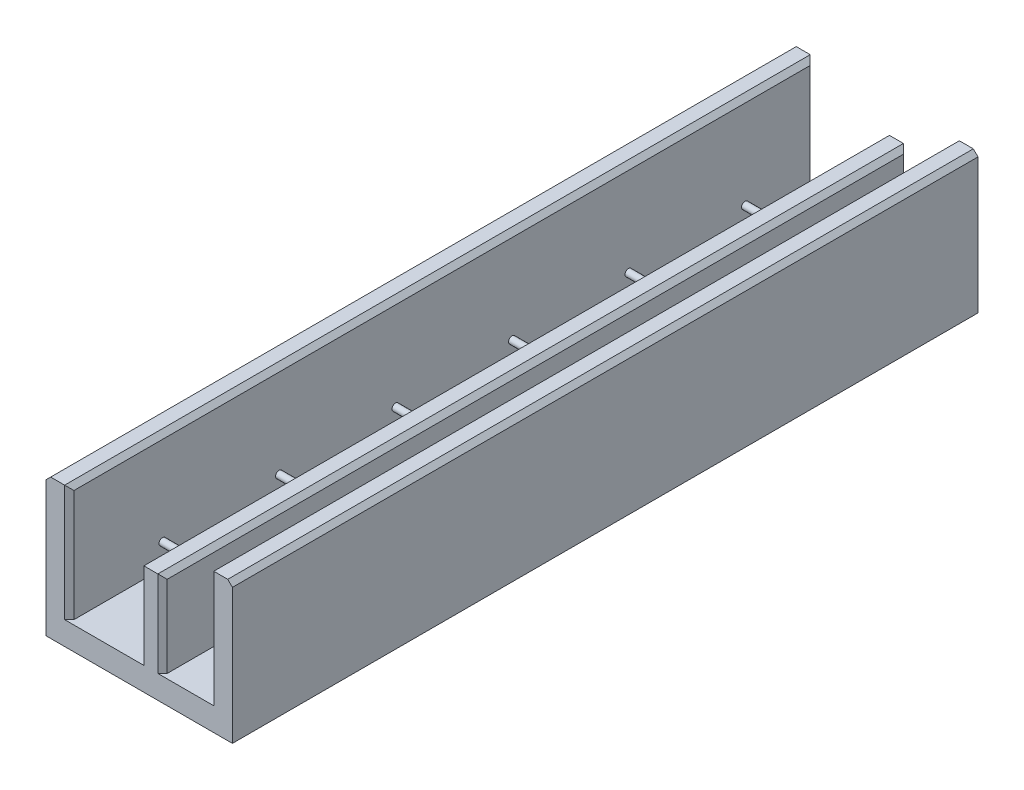
ISO-10303-21;
HEADER;
FILE_DESCRIPTION(('STEP AP214'),'2;1');
FILE_NAME('part.step','',(''),(''),'','','');
FILE_SCHEMA(('AUTOMOTIVE_DESIGN { 1 0 10303 214 1 1 1 1 }'));
ENDSEC;
DATA;
#1=APPLICATION_CONTEXT('core data for automotive mechanical design processes');
#2=APPLICATION_PROTOCOL_DEFINITION('international standard','automotive_design',2000,#1);
#3=PRODUCT_CONTEXT('',#1,'mechanical');
#4=PRODUCT('Part','Part','',(#3));
#5=PRODUCT_RELATED_PRODUCT_CATEGORY('part','',(#4));
#6=PRODUCT_DEFINITION_FORMATION('','',#4);
#7=PRODUCT_DEFINITION_CONTEXT('part definition',#1,'design');
#8=PRODUCT_DEFINITION('design','',#6,#7);
#9=PRODUCT_DEFINITION_SHAPE('','',#8);
#10=(LENGTH_UNIT() NAMED_UNIT(*) SI_UNIT(.MILLI.,.METRE.));
#11=(NAMED_UNIT(*) PLANE_ANGLE_UNIT() SI_UNIT($,.RADIAN.));
#12=(NAMED_UNIT(*) SI_UNIT($,.STERADIAN.) SOLID_ANGLE_UNIT());
#13=UNCERTAINTY_MEASURE_WITH_UNIT(LENGTH_MEASURE(1.E-05),#10,'distance_accuracy_value','');
#14=(GEOMETRIC_REPRESENTATION_CONTEXT(3) GLOBAL_UNCERTAINTY_ASSIGNED_CONTEXT((#13)) GLOBAL_UNIT_ASSIGNED_CONTEXT((#10,
#11,#12)) REPRESENTATION_CONTEXT('',''));
#15=CARTESIAN_POINT('',(0.,0.,0.));
#16=DIRECTION('',(0.,0.,1.));
#17=DIRECTION('',(1.,0.,0.));
#18=AXIS2_PLACEMENT_3D('',#15,#16,#17);
#19=CARTESIAN_POINT('',(0.,600.,3200.));
#20=DIRECTION('',(-1.,0.,0.));
#21=DIRECTION('',(0.,0.,1.));
#22=AXIS2_PLACEMENT_3D('',#19,#20,#21);
#23=PLANE('',#22);
#24=DIRECTION('',(0.,1.,0.));
#25=VECTOR('',#24,1.);
#26=CARTESIAN_POINT('',(0.,600.,0.));
#27=LINE('',#26,#25);
#28=CARTESIAN_POINT('',(0.,0.,0.));
#29=VERTEX_POINT('',#28);
#30=CARTESIAN_POINT('',(0.,580.,0.));
#31=VERTEX_POINT('',#30);
#32=EDGE_CURVE('E219',#29,#31,#27,.T.);
#33=ORIENTED_EDGE('',*,*,#32,.T.);
#34=DIRECTION('',(0.,0.,1.));
#35=VECTOR('',#34,1.);
#36=CARTESIAN_POINT('',(0.,580.,3200.));
#37=LINE('',#36,#35);
#38=CARTESIAN_POINT('',(0.,580.,3200.));
#39=VERTEX_POINT('',#38);
#40=EDGE_CURVE('E289',#31,#39,#37,.T.);
#41=ORIENTED_EDGE('',*,*,#40,.T.);
#42=DIRECTION('',(0.,1.,0.));
#43=VECTOR('',#42,1.);
#44=CARTESIAN_POINT('',(0.,600.,3200.));
#45=LINE('',#44,#43);
#46=CARTESIAN_POINT('',(0.,0.,3200.));
#47=VERTEX_POINT('',#46);
#48=EDGE_CURVE('E238',#47,#39,#45,.T.);
#49=ORIENTED_EDGE('',*,*,#48,.F.);
#50=DIRECTION('',(0.,0.,-1.));
#51=VECTOR('',#50,1.);
#52=CARTESIAN_POINT('',(0.,0.,3200.));
#53=LINE('',#52,#51);
#54=EDGE_CURVE('E210',#47,#29,#53,.T.);
#55=ORIENTED_EDGE('',*,*,#54,.T.);
#56=EDGE_LOOP('',(#33,#41,#49,#55));
#57=FACE_BOUND('',#56,.T.);
#58=ADVANCED_FACE('F37',(#57),#23,.F.);
#59=CARTESIAN_POINT('',(-99.9999999999998,600.,3200.));
#60=DIRECTION('',(0.,-1.,0.));
#61=DIRECTION('',(0.,0.,-1.));
#62=AXIS2_PLACEMENT_3D('',#59,#60,#61);
#63=PLANE('',#62);
#64=DIRECTION('',(-1.,0.,0.));
#65=VECTOR('',#64,1.);
#66=CARTESIAN_POINT('',(-99.9999999999998,600.,3200.));
#67=LINE('',#66,#65);
#68=CARTESIAN_POINT('',(-20.,600.,3200.));
#69=VERTEX_POINT('',#68);
#70=CARTESIAN_POINT('',(-79.9999999999997,600.,3200.));
#71=VERTEX_POINT('',#70);
#72=EDGE_CURVE('E369',#69,#71,#67,.T.);
#73=ORIENTED_EDGE('',*,*,#72,.F.);
#74=DIRECTION('',(0.,0.,-1.));
#75=VECTOR('',#74,1.);
#76=CARTESIAN_POINT('',(-20.,600.,3200.));
#77=LINE('',#76,#75);
#78=CARTESIAN_POINT('',(-20.,600.,0.));
#79=VERTEX_POINT('',#78);
#80=EDGE_CURVE('E286',#69,#79,#77,.T.);
#81=ORIENTED_EDGE('',*,*,#80,.T.);
#82=DIRECTION('',(-1.,0.,0.));
#83=VECTOR('',#82,1.);
#84=CARTESIAN_POINT('',(-99.9999999999998,600.,0.));
#85=LINE('',#84,#83);
#86=CARTESIAN_POINT('',(-79.9999999999997,600.,0.));
#87=VERTEX_POINT('',#86);
#88=EDGE_CURVE('E222',#79,#87,#85,.T.);
#89=ORIENTED_EDGE('',*,*,#88,.T.);
#90=DIRECTION('',(0.,0.,1.));
#91=VECTOR('',#90,1.);
#92=CARTESIAN_POINT('',(-79.9999999999997,600.,3200.));
#93=LINE('',#92,#91);
#94=EDGE_CURVE('E284',#87,#71,#93,.T.);
#95=ORIENTED_EDGE('',*,*,#94,.T.);
#96=EDGE_LOOP('',(#73,#81,#89,#95));
#97=FACE_BOUND('',#96,.T.);
#98=ADVANCED_FACE('F398',(#97),#63,.F.);
#99=CARTESIAN_POINT('',(-99.9999999999998,99.9999999999999,3200.));
#100=DIRECTION('',(1.,0.,0.));
#101=DIRECTION('',(0.,0.,-1.));
#102=AXIS2_PLACEMENT_3D('',#99,#100,#101);
#103=PLANE('',#102);
#104=CARTESIAN_POINT('',(-99.9999999999998,200.,2800.));
#105=DIRECTION('',(1.,0.,0.));
#106=DIRECTION('',(0.,0.,-1.));
#107=AXIS2_PLACEMENT_3D('',#104,#105,#106);
#108=CIRCLE('',#107,15.);
#109=CARTESIAN_POINT('',(-99.9999999999998,200.,2785.));
#110=VERTEX_POINT('',#109);
#111=EDGE_CURVE('E925',#110,#110,#108,.F.);
#112=ORIENTED_EDGE('',*,*,#111,.F.);
#113=EDGE_LOOP('',(#112));
#114=FACE_BOUND('',#113,.T.);
#115=CARTESIAN_POINT('',(-99.9999999999998,200.,2300.));
#116=DIRECTION('',(1.,0.,0.));
#117=DIRECTION('',(0.,0.,-1.));
#118=AXIS2_PLACEMENT_3D('',#115,#116,#117);
#119=CIRCLE('',#118,15.);
#120=CARTESIAN_POINT('',(-99.9999999999998,200.,2285.));
#121=VERTEX_POINT('',#120);
#122=EDGE_CURVE('E916',#121,#121,#119,.F.);
#123=ORIENTED_EDGE('',*,*,#122,.F.);
#124=EDGE_LOOP('',(#123));
#125=FACE_BOUND('',#124,.T.);
#126=CARTESIAN_POINT('',(-99.9999999999998,200.,1800.));
#127=DIRECTION('',(1.,0.,0.));
#128=DIRECTION('',(0.,0.,-1.));
#129=AXIS2_PLACEMENT_3D('',#126,#127,#128);
#130=CIRCLE('',#129,15.);
#131=CARTESIAN_POINT('',(-99.9999999999998,200.,1785.));
#132=VERTEX_POINT('',#131);
#133=EDGE_CURVE('E906',#132,#132,#130,.F.);
#134=ORIENTED_EDGE('',*,*,#133,.F.);
#135=EDGE_LOOP('',(#134));
#136=FACE_BOUND('',#135,.T.);
#137=CARTESIAN_POINT('',(-99.9999999999998,200.,1300.));
#138=DIRECTION('',(1.,0.,0.));
#139=DIRECTION('',(0.,0.,-1.));
#140=AXIS2_PLACEMENT_3D('',#137,#138,#139);
#141=CIRCLE('',#140,15.);
#142=CARTESIAN_POINT('',(-99.9999999999998,200.,1285.));
#143=VERTEX_POINT('',#142);
#144=EDGE_CURVE('E896',#143,#143,#141,.F.);
#145=ORIENTED_EDGE('',*,*,#144,.F.);
#146=EDGE_LOOP('',(#145));
#147=FACE_BOUND('',#146,.T.);
#148=CARTESIAN_POINT('',(-99.9999999999998,200.,800.));
#149=DIRECTION('',(1.,0.,0.));
#150=DIRECTION('',(0.,0.,-1.));
#151=AXIS2_PLACEMENT_3D('',#148,#149,#150);
#152=CIRCLE('',#151,15.);
#153=CARTESIAN_POINT('',(-99.9999999999998,200.,785.));
#154=VERTEX_POINT('',#153);
#155=EDGE_CURVE('E885',#154,#154,#152,.F.);
#156=ORIENTED_EDGE('',*,*,#155,.F.);
#157=EDGE_LOOP('',(#156));
#158=FACE_BOUND('',#157,.T.);
#159=CARTESIAN_POINT('',(-99.9999999999998,200.,300.));
#160=DIRECTION('',(1.,0.,0.));
#161=DIRECTION('',(0.,0.,-1.));
#162=AXIS2_PLACEMENT_3D('',#159,#160,#161);
#163=CIRCLE('',#162,15.);
#164=CARTESIAN_POINT('',(-99.9999999999998,200.,285.));
#165=VERTEX_POINT('',#164);
#166=EDGE_CURVE('E556',#165,#165,#163,.F.);
#167=ORIENTED_EDGE('',*,*,#166,.F.);
#168=EDGE_LOOP('',(#167));
#169=FACE_BOUND('',#168,.T.);
#170=DIRECTION('',(0.,0.,-1.));
#171=VECTOR('',#170,1.);
#172=CARTESIAN_POINT('',(-99.9999999999998,580.,3200.));
#173=LINE('',#172,#171);
#174=CARTESIAN_POINT('',(-99.9999999999998,580.,3180.));
#175=VERTEX_POINT('',#174);
#176=CARTESIAN_POINT('',(-99.9999999999998,580.,19.9999999999996));
#177=VERTEX_POINT('',#176);
#178=EDGE_CURVE('E300',#175,#177,#173,.T.);
#179=ORIENTED_EDGE('',*,*,#178,.T.);
#180=DIRECTION('',(0.,-1.,0.));
#181=VECTOR('',#180,1.);
#182=CARTESIAN_POINT('',(-99.9999999999998,99.9999999999999,19.9999999999996));
#183=LINE('',#182,#181);
#184=CARTESIAN_POINT('',(-99.9999999999998,99.9999999999999,19.9999999999996));
#185=VERTEX_POINT('',#184);
#186=EDGE_CURVE('E302',#177,#185,#183,.T.);
#187=ORIENTED_EDGE('',*,*,#186,.T.);
#188=DIRECTION('',(0.,0.,-1.));
#189=VECTOR('',#188,1.);
#190=CARTESIAN_POINT('',(-99.9999999999998,99.9999999999999,3200.));
#191=LINE('',#190,#189);
#192=CARTESIAN_POINT('',(-99.9999999999998,99.9999999999999,3180.));
#193=VERTEX_POINT('',#192);
#194=EDGE_CURVE('E248',#193,#185,#191,.T.);
#195=ORIENTED_EDGE('',*,*,#194,.F.);
#196=DIRECTION('',(0.,1.,0.));
#197=VECTOR('',#196,1.);
#198=CARTESIAN_POINT('',(-99.9999999999998,99.9999999999999,3180.));
#199=LINE('',#198,#197);
#200=EDGE_CURVE('E298',#193,#175,#199,.T.);
#201=ORIENTED_EDGE('',*,*,#200,.T.);
#202=EDGE_LOOP('',(#179,#187,#195,#201));
#203=FACE_BOUND('',#202,.T.);
#204=ADVANCED_FACE('F418',(#114,#125,#136,#147,#158,#169,#203),#103,.F.);
#205=CARTESIAN_POINT('',(-300.,99.9999999999999,3200.));
#206=DIRECTION('',(0.,-1.,0.));
#207=DIRECTION('',(1.,0.,0.));
#208=AXIS2_PLACEMENT_3D('',#205,#206,#207);
#209=PLANE('',#208);
#210=DIRECTION('',(-1.,0.,0.));
#211=VECTOR('',#210,1.);
#212=CARTESIAN_POINT('',(-300.,99.9999999999999,0.));
#213=LINE('',#212,#211);
#214=CARTESIAN_POINT('',(-79.9999999999997,99.9999999999999,0.));
#215=VERTEX_POINT('',#214);
#216=CARTESIAN_POINT('',(-320.,99.9999999999999,0.));
#217=VERTEX_POINT('',#216);
#218=EDGE_CURVE('E226',#215,#217,#213,.T.);
#219=ORIENTED_EDGE('',*,*,#218,.T.);
#220=DIRECTION('',(0.707106781186548,0.,0.707106781186547));
#221=VECTOR('',#220,1.);
#222=CARTESIAN_POINT('',(1290.,100.,1610.));
#223=LINE('',#222,#221);
#224=CARTESIAN_POINT('',(-300.,99.9999999999999,20.));
#225=VERTEX_POINT('',#224);
#226=EDGE_CURVE('E330',#217,#225,#223,.T.);
#227=ORIENTED_EDGE('',*,*,#226,.T.);
#228=DIRECTION('',(0.,0.,-1.));
#229=VECTOR('',#228,1.);
#230=CARTESIAN_POINT('',(-300.,99.9999999999999,3200.));
#231=LINE('',#230,#229);
#232=CARTESIAN_POINT('',(-300.,99.9999999999999,3180.));
#233=VERTEX_POINT('',#232);
#234=EDGE_CURVE('E245',#233,#225,#231,.T.);
#235=ORIENTED_EDGE('',*,*,#234,.F.);
#236=DIRECTION('',(0.707106781186548,0.,-0.707106781186547));
#237=VECTOR('',#236,1.);
#238=CARTESIAN_POINT('',(-310.,99.9999999999999,3190.));
#239=LINE('',#238,#237);
#240=CARTESIAN_POINT('',(-320.,99.9999999999999,3200.));
#241=VERTEX_POINT('',#240);
#242=EDGE_CURVE('E332',#233,#241,#239,.F.);
#243=ORIENTED_EDGE('',*,*,#242,.T.);
#244=DIRECTION('',(-1.,0.,0.));
#245=VECTOR('',#244,1.);
#246=CARTESIAN_POINT('',(-300.,99.9999999999999,3200.));
#247=LINE('',#246,#245);
#248=CARTESIAN_POINT('',(-79.9999999999997,99.9999999999999,3200.));
#249=VERTEX_POINT('',#248);
#250=EDGE_CURVE('E372',#249,#241,#247,.T.);
#251=ORIENTED_EDGE('',*,*,#250,.F.);
#252=DIRECTION('',(0.707106781186555,0.,0.70710678118654));
#253=VECTOR('',#252,1.);
#254=CARTESIAN_POINT('',(-190.000000000002,99.9999999999999,3090.));
#255=LINE('',#254,#253);
#256=EDGE_CURVE('E328',#249,#193,#255,.F.);
#257=ORIENTED_EDGE('',*,*,#256,.T.);
#258=ORIENTED_EDGE('',*,*,#194,.T.);
#259=DIRECTION('',(0.707106781186555,0.,-0.70710678118654));
#260=VECTOR('',#259,1.);
#261=CARTESIAN_POINT('',(-1790.,99.9999999999998,1709.99999999996));
#262=LINE('',#261,#260);
#263=EDGE_CURVE('E325',#185,#215,#262,.T.);
#264=ORIENTED_EDGE('',*,*,#263,.T.);
#265=EDGE_LOOP('',(#219,#227,#235,#243,#251,#257,#258,#264));
#266=FACE_BOUND('',#265,.T.);
#267=ADVANCED_FACE('F416',(#266),#209,.F.);
#268=CARTESIAN_POINT('',(-300.,470.,3200.));
#269=DIRECTION('',(-1.,0.,0.));
#270=DIRECTION('',(0.,-1.,0.));
#271=AXIS2_PLACEMENT_3D('',#268,#269,#270);
#272=PLANE('',#271);
#273=CARTESIAN_POINT('',(-300.,200.,2800.));
#274=DIRECTION('',(-1.,0.,0.));
#275=DIRECTION('',(0.,-1.,0.));
#276=AXIS2_PLACEMENT_3D('',#273,#274,#275);
#277=CIRCLE('',#276,15.);
#278=CARTESIAN_POINT('',(-300.,185.,2800.));
#279=VERTEX_POINT('',#278);
#280=EDGE_CURVE('E537',#279,#279,#277,.T.);
#281=ORIENTED_EDGE('',*,*,#280,.T.);
#282=EDGE_LOOP('',(#281));
#283=FACE_BOUND('',#282,.T.);
#284=CARTESIAN_POINT('',(-300.,200.,2300.));
#285=DIRECTION('',(-1.,0.,0.));
#286=DIRECTION('',(0.,-1.,0.));
#287=AXIS2_PLACEMENT_3D('',#284,#285,#286);
#288=CIRCLE('',#287,15.);
#289=CARTESIAN_POINT('',(-300.,185.,2300.));
#290=VERTEX_POINT('',#289);
#291=EDGE_CURVE('E541',#290,#290,#288,.T.);
#292=ORIENTED_EDGE('',*,*,#291,.T.);
#293=EDGE_LOOP('',(#292));
#294=FACE_BOUND('',#293,.T.);
#295=CARTESIAN_POINT('',(-300.,200.,1800.));
#296=DIRECTION('',(-1.,0.,0.));
#297=DIRECTION('',(0.,-1.,0.));
#298=AXIS2_PLACEMENT_3D('',#295,#296,#297);
#299=CIRCLE('',#298,15.);
#300=CARTESIAN_POINT('',(-300.,185.,1800.));
#301=VERTEX_POINT('',#300);
#302=EDGE_CURVE('E545',#301,#301,#299,.T.);
#303=ORIENTED_EDGE('',*,*,#302,.T.);
#304=EDGE_LOOP('',(#303));
#305=FACE_BOUND('',#304,.T.);
#306=CARTESIAN_POINT('',(-300.,200.,1300.));
#307=DIRECTION('',(-1.,0.,0.));
#308=DIRECTION('',(0.,-1.,0.));
#309=AXIS2_PLACEMENT_3D('',#306,#307,#308);
#310=CIRCLE('',#309,15.);
#311=CARTESIAN_POINT('',(-300.,185.,1300.));
#312=VERTEX_POINT('',#311);
#313=EDGE_CURVE('E549',#312,#312,#310,.T.);
#314=ORIENTED_EDGE('',*,*,#313,.T.);
#315=EDGE_LOOP('',(#314));
#316=FACE_BOUND('',#315,.T.);
#317=CARTESIAN_POINT('',(-300.,200.,800.));
#318=DIRECTION('',(-1.,0.,0.));
#319=DIRECTION('',(0.,-1.,0.));
#320=AXIS2_PLACEMENT_3D('',#317,#318,#319);
#321=CIRCLE('',#320,15.);
#322=CARTESIAN_POINT('',(-300.,185.,800.));
#323=VERTEX_POINT('',#322);
#324=EDGE_CURVE('E552',#323,#323,#321,.T.);
#325=ORIENTED_EDGE('',*,*,#324,.T.);
#326=EDGE_LOOP('',(#325));
#327=FACE_BOUND('',#326,.T.);
#328=CARTESIAN_POINT('',(-300.,200.,300.));
#329=DIRECTION('',(-1.,0.,0.));
#330=DIRECTION('',(0.,-1.,0.));
#331=AXIS2_PLACEMENT_3D('',#328,#329,#330);
#332=CIRCLE('',#331,15.);
#333=CARTESIAN_POINT('',(-300.,185.,300.));
#334=VERTEX_POINT('',#333);
#335=EDGE_CURVE('E353',#334,#334,#332,.T.);
#336=ORIENTED_EDGE('',*,*,#335,.T.);
#337=EDGE_LOOP('',(#336));
#338=FACE_BOUND('',#337,.T.);
#339=ORIENTED_EDGE('',*,*,#234,.T.);
#340=DIRECTION('',(0.,1.,0.));
#341=VECTOR('',#340,1.);
#342=CARTESIAN_POINT('',(-300.,470.,20.));
#343=LINE('',#342,#341);
#344=CARTESIAN_POINT('',(-300.,450.,20.));
#345=VERTEX_POINT('',#344);
#346=EDGE_CURVE('E309',#225,#345,#343,.T.);
#347=ORIENTED_EDGE('',*,*,#346,.T.);
#348=DIRECTION('',(0.,0.,1.));
#349=VECTOR('',#348,1.);
#350=CARTESIAN_POINT('',(-300.,450.,3200.));
#351=LINE('',#350,#349);
#352=CARTESIAN_POINT('',(-300.,450.,3180.));
#353=VERTEX_POINT('',#352);
#354=EDGE_CURVE('E305',#345,#353,#351,.T.);
#355=ORIENTED_EDGE('',*,*,#354,.T.);
#356=DIRECTION('',(0.,-1.,0.));
#357=VECTOR('',#356,1.);
#358=CARTESIAN_POINT('',(-300.,470.,3180.));
#359=LINE('',#358,#357);
#360=EDGE_CURVE('E307',#353,#233,#359,.T.);
#361=ORIENTED_EDGE('',*,*,#360,.T.);
#362=EDGE_LOOP('',(#339,#347,#355,#361));
#363=FACE_BOUND('',#362,.T.);
#364=ADVANCED_FACE('F426',(#283,#294,#305,#316,#327,#338,#363),#272,.F.);
#365=CARTESIAN_POINT('',(-400.,470.,3200.));
#366=DIRECTION('',(0.,-1.,0.));
#367=DIRECTION('',(0.,0.,-1.));
#368=AXIS2_PLACEMENT_3D('',#365,#366,#367);
#369=PLANE('',#368);
#370=DIRECTION('',(-1.,0.,0.));
#371=VECTOR('',#370,1.);
#372=CARTESIAN_POINT('',(-400.,470.,3200.));
#373=LINE('',#372,#371);
#374=CARTESIAN_POINT('',(-320.,470.,3200.));
#375=VERTEX_POINT('',#374);
#376=CARTESIAN_POINT('',(-380.,470.,3200.));
#377=VERTEX_POINT('',#376);
#378=EDGE_CURVE('E374',#375,#377,#373,.T.);
#379=ORIENTED_EDGE('',*,*,#378,.F.);
#380=DIRECTION('',(0.,0.,-1.));
#381=VECTOR('',#380,1.);
#382=CARTESIAN_POINT('',(-320.,470.,3200.));
#383=LINE('',#382,#381);
#384=CARTESIAN_POINT('',(-320.,470.,0.));
#385=VERTEX_POINT('',#384);
#386=EDGE_CURVE('E314',#375,#385,#383,.T.);
#387=ORIENTED_EDGE('',*,*,#386,.T.);
#388=DIRECTION('',(-1.,0.,0.));
#389=VECTOR('',#388,1.);
#390=CARTESIAN_POINT('',(-400.,470.,0.));
#391=LINE('',#390,#389);
#392=CARTESIAN_POINT('',(-380.,470.,0.));
#393=VERTEX_POINT('',#392);
#394=EDGE_CURVE('E228',#385,#393,#391,.T.);
#395=ORIENTED_EDGE('',*,*,#394,.T.);
#396=DIRECTION('',(0.,0.,1.));
#397=VECTOR('',#396,1.);
#398=CARTESIAN_POINT('',(-380.,470.,3200.));
#399=LINE('',#398,#397);
#400=EDGE_CURVE('E312',#393,#377,#399,.T.);
#401=ORIENTED_EDGE('',*,*,#400,.T.);
#402=EDGE_LOOP('',(#379,#387,#395,#401));
#403=FACE_BOUND('',#402,.T.);
#404=ADVANCED_FACE('F487',(#403),#369,.F.);
#405=CARTESIAN_POINT('',(-400.,99.9999999999999,3200.));
#406=DIRECTION('',(1.,0.,0.));
#407=DIRECTION('',(0.,0.,-1.));
#408=AXIS2_PLACEMENT_3D('',#405,#406,#407);
#409=PLANE('',#408);
#410=CARTESIAN_POINT('',(-400.,200.,2800.));
#411=DIRECTION('',(1.,0.,0.));
#412=DIRECTION('',(0.,0.,-1.));
#413=AXIS2_PLACEMENT_3D('',#410,#411,#412);
#414=CIRCLE('',#413,15.);
#415=CARTESIAN_POINT('',(-400.,200.,2785.));
#416=VERTEX_POINT('',#415);
#417=EDGE_CURVE('E920',#416,#416,#414,.T.);
#418=ORIENTED_EDGE('',*,*,#417,.T.);
#419=EDGE_LOOP('',(#418));
#420=FACE_BOUND('',#419,.T.);
#421=CARTESIAN_POINT('',(-400.,200.,2300.));
#422=DIRECTION('',(1.,0.,0.));
#423=DIRECTION('',(0.,0.,-1.));
#424=AXIS2_PLACEMENT_3D('',#421,#422,#423);
#425=CIRCLE('',#424,15.);
#426=CARTESIAN_POINT('',(-400.,200.,2285.));
#427=VERTEX_POINT('',#426);
#428=EDGE_CURVE('E910',#427,#427,#425,.T.);
#429=ORIENTED_EDGE('',*,*,#428,.T.);
#430=EDGE_LOOP('',(#429));
#431=FACE_BOUND('',#430,.T.);
#432=CARTESIAN_POINT('',(-400.,200.,1800.));
#433=DIRECTION('',(1.,0.,0.));
#434=DIRECTION('',(0.,0.,-1.));
#435=AXIS2_PLACEMENT_3D('',#432,#433,#434);
#436=CIRCLE('',#435,15.);
#437=CARTESIAN_POINT('',(-400.,200.,1785.));
#438=VERTEX_POINT('',#437);
#439=EDGE_CURVE('E900',#438,#438,#436,.T.);
#440=ORIENTED_EDGE('',*,*,#439,.T.);
#441=EDGE_LOOP('',(#440));
#442=FACE_BOUND('',#441,.T.);
#443=CARTESIAN_POINT('',(-400.,200.,1300.));
#444=DIRECTION('',(1.,0.,0.));
#445=DIRECTION('',(0.,0.,-1.));
#446=AXIS2_PLACEMENT_3D('',#443,#444,#445);
#447=CIRCLE('',#446,15.);
#448=CARTESIAN_POINT('',(-400.,200.,1285.));
#449=VERTEX_POINT('',#448);
#450=EDGE_CURVE('E890',#449,#449,#447,.T.);
#451=ORIENTED_EDGE('',*,*,#450,.T.);
#452=EDGE_LOOP('',(#451));
#453=FACE_BOUND('',#452,.T.);
#454=CARTESIAN_POINT('',(-400.,200.,800.));
#455=DIRECTION('',(1.,0.,0.));
#456=DIRECTION('',(0.,0.,-1.));
#457=AXIS2_PLACEMENT_3D('',#454,#455,#456);
#458=CIRCLE('',#457,15.);
#459=CARTESIAN_POINT('',(-400.,200.,785.));
#460=VERTEX_POINT('',#459);
#461=EDGE_CURVE('E557',#460,#460,#458,.T.);
#462=ORIENTED_EDGE('',*,*,#461,.T.);
#463=EDGE_LOOP('',(#462));
#464=FACE_BOUND('',#463,.T.);
#465=CARTESIAN_POINT('',(-400.,200.,300.));
#466=DIRECTION('',(1.,0.,0.));
#467=DIRECTION('',(0.,0.,-1.));
#468=AXIS2_PLACEMENT_3D('',#465,#466,#467);
#469=CIRCLE('',#468,15.);
#470=CARTESIAN_POINT('',(-400.,200.,285.));
#471=VERTEX_POINT('',#470);
#472=EDGE_CURVE('E359',#471,#471,#469,.T.);
#473=ORIENTED_EDGE('',*,*,#472,.T.);
#474=EDGE_LOOP('',(#473));
#475=FACE_BOUND('',#474,.T.);
#476=DIRECTION('',(0.,0.,-1.));
#477=VECTOR('',#476,1.);
#478=CARTESIAN_POINT('',(-400.,450.,3200.));
#479=LINE('',#478,#477);
#480=CARTESIAN_POINT('',(-400.,450.,3180.));
#481=VERTEX_POINT('',#480);
#482=CARTESIAN_POINT('',(-400.,450.,20.));
#483=VERTEX_POINT('',#482);
#484=EDGE_CURVE('E54',#481,#483,#479,.T.);
#485=ORIENTED_EDGE('',*,*,#484,.T.);
#486=DIRECTION('',(0.,-1.,0.));
#487=VECTOR('',#486,1.);
#488=CARTESIAN_POINT('',(-400.,99.9999999999999,20.));
#489=LINE('',#488,#487);
#490=CARTESIAN_POINT('',(-400.,99.9999999999999,20.));
#491=VERTEX_POINT('',#490);
#492=EDGE_CURVE('E318',#483,#491,#489,.T.);
#493=ORIENTED_EDGE('',*,*,#492,.T.);
#494=DIRECTION('',(0.,0.,-1.));
#495=VECTOR('',#494,1.);
#496=CARTESIAN_POINT('',(-400.,99.9999999999999,3200.));
#497=LINE('',#496,#495);
#498=CARTESIAN_POINT('',(-400.,99.9999999999999,3180.));
#499=VERTEX_POINT('',#498);
#500=EDGE_CURVE('E242',#499,#491,#497,.T.);
#501=ORIENTED_EDGE('',*,*,#500,.F.);
#502=DIRECTION('',(0.,1.,0.));
#503=VECTOR('',#502,1.);
#504=CARTESIAN_POINT('',(-400.,99.9999999999999,3180.));
#505=LINE('',#504,#503);
#506=EDGE_CURVE('E59',#499,#481,#505,.T.);
#507=ORIENTED_EDGE('',*,*,#506,.T.);
#508=EDGE_LOOP('',(#485,#493,#501,#507));
#509=FACE_BOUND('',#508,.T.);
#510=ADVANCED_FACE('F498',(#420,#431,#442,#453,#464,#475,#509),#409,.F.);
#511=CARTESIAN_POINT('',(-700.,99.9999999999999,3200.));
#512=DIRECTION('',(0.,-1.,0.));
#513=DIRECTION('',(1.,0.,0.));
#514=AXIS2_PLACEMENT_3D('',#511,#512,#513);
#515=PLANE('',#514);
#516=DIRECTION('',(-1.,0.,0.));
#517=VECTOR('',#516,1.);
#518=CARTESIAN_POINT('',(-700.,99.9999999999999,0.));
#519=LINE('',#518,#517);
#520=CARTESIAN_POINT('',(-380.,99.9999999999999,0.));
#521=VERTEX_POINT('',#520);
#522=CARTESIAN_POINT('',(-720.,99.9999999999999,0.));
#523=VERTEX_POINT('',#522);
#524=EDGE_CURVE('E231',#521,#523,#519,.T.);
#525=ORIENTED_EDGE('',*,*,#524,.T.);
#526=DIRECTION('',(0.707106781186548,0.,0.707106781186547));
#527=VECTOR('',#526,1.);
#528=CARTESIAN_POINT('',(890.,99.9999999999998,1610.));
#529=LINE('',#528,#527);
#530=CARTESIAN_POINT('',(-700.,99.9999999999999,20.));
#531=VERTEX_POINT('',#530);
#532=EDGE_CURVE('E320',#523,#531,#529,.T.);
#533=ORIENTED_EDGE('',*,*,#532,.T.);
#534=DIRECTION('',(0.,0.,-1.));
#535=VECTOR('',#534,1.);
#536=CARTESIAN_POINT('',(-700.,99.9999999999999,3200.));
#537=LINE('',#536,#535);
#538=CARTESIAN_POINT('',(-700.,99.9999999999999,3180.));
#539=VERTEX_POINT('',#538);
#540=EDGE_CURVE('E209',#539,#531,#537,.T.);
#541=ORIENTED_EDGE('',*,*,#540,.F.);
#542=DIRECTION('',(0.707106781186548,0.,-0.707106781186547));
#543=VECTOR('',#542,1.);
#544=CARTESIAN_POINT('',(-710.,99.9999999999999,3190.));
#545=LINE('',#544,#543);
#546=CARTESIAN_POINT('',(-720.,99.9999999999999,3200.));
#547=VERTEX_POINT('',#546);
#548=EDGE_CURVE('E322',#539,#547,#545,.F.);
#549=ORIENTED_EDGE('',*,*,#548,.T.);
#550=DIRECTION('',(-1.,0.,0.));
#551=VECTOR('',#550,1.);
#552=CARTESIAN_POINT('',(-700.,99.9999999999999,3200.));
#553=LINE('',#552,#551);
#554=CARTESIAN_POINT('',(-380.,99.9999999999999,3200.));
#555=VERTEX_POINT('',#554);
#556=EDGE_CURVE('E377',#555,#547,#553,.T.);
#557=ORIENTED_EDGE('',*,*,#556,.F.);
#558=DIRECTION('',(0.707106781186548,0.,0.707106781186548));
#559=VECTOR('',#558,1.);
#560=CARTESIAN_POINT('',(-540.,99.9999999999999,3040.));
#561=LINE('',#560,#559);
#562=EDGE_CURVE('E11',#555,#499,#561,.F.);
#563=ORIENTED_EDGE('',*,*,#562,.T.);
#564=ORIENTED_EDGE('',*,*,#500,.T.);
#565=DIRECTION('',(0.707106781186548,0.,-0.707106781186548));
#566=VECTOR('',#565,1.);
#567=CARTESIAN_POINT('',(-2140.,99.9999999999999,1760.));
#568=LINE('',#567,#566);
#569=EDGE_CURVE('E46',#491,#521,#568,.T.);
#570=ORIENTED_EDGE('',*,*,#569,.T.);
#571=EDGE_LOOP('',(#525,#533,#541,#549,#557,#563,#564,#570));
#572=FACE_BOUND('',#571,.T.);
#573=ADVANCED_FACE('F499',(#572),#515,.F.);
#574=CARTESIAN_POINT('',(-700.,600.,3200.));
#575=DIRECTION('',(-1.,0.,0.));
#576=DIRECTION('',(0.,-1.,0.));
#577=AXIS2_PLACEMENT_3D('',#574,#575,#576);
#578=PLANE('',#577);
#579=CARTESIAN_POINT('',(-700.,200.,2800.));
#580=DIRECTION('',(-1.,0.,0.));
#581=DIRECTION('',(0.,-1.,0.));
#582=AXIS2_PLACEMENT_3D('',#579,#580,#581);
#583=CIRCLE('',#582,15.);
#584=CARTESIAN_POINT('',(-700.,185.,2800.));
#585=VERTEX_POINT('',#584);
#586=EDGE_CURVE('E923',#585,#585,#583,.T.);
#587=ORIENTED_EDGE('',*,*,#586,.T.);
#588=EDGE_LOOP('',(#587));
#589=FACE_BOUND('',#588,.T.);
#590=CARTESIAN_POINT('',(-700.,200.,2300.));
#591=DIRECTION('',(-1.,0.,0.));
#592=DIRECTION('',(0.,-1.,0.));
#593=AXIS2_PLACEMENT_3D('',#590,#591,#592);
#594=CIRCLE('',#593,15.);
#595=CARTESIAN_POINT('',(-700.,185.,2300.));
#596=VERTEX_POINT('',#595);
#597=EDGE_CURVE('E913',#596,#596,#594,.T.);
#598=ORIENTED_EDGE('',*,*,#597,.T.);
#599=EDGE_LOOP('',(#598));
#600=FACE_BOUND('',#599,.T.);
#601=CARTESIAN_POINT('',(-700.,200.,1800.));
#602=DIRECTION('',(-1.,0.,0.));
#603=DIRECTION('',(0.,-1.,0.));
#604=AXIS2_PLACEMENT_3D('',#601,#602,#603);
#605=CIRCLE('',#604,15.);
#606=CARTESIAN_POINT('',(-700.,185.,1800.));
#607=VERTEX_POINT('',#606);
#608=EDGE_CURVE('E903',#607,#607,#605,.T.);
#609=ORIENTED_EDGE('',*,*,#608,.T.);
#610=EDGE_LOOP('',(#609));
#611=FACE_BOUND('',#610,.T.);
#612=CARTESIAN_POINT('',(-700.,200.,1300.));
#613=DIRECTION('',(-1.,0.,0.));
#614=DIRECTION('',(0.,-1.,0.));
#615=AXIS2_PLACEMENT_3D('',#612,#613,#614);
#616=CIRCLE('',#615,15.);
#617=CARTESIAN_POINT('',(-700.,185.,1300.));
#618=VERTEX_POINT('',#617);
#619=EDGE_CURVE('E893',#618,#618,#616,.T.);
#620=ORIENTED_EDGE('',*,*,#619,.T.);
#621=EDGE_LOOP('',(#620));
#622=FACE_BOUND('',#621,.T.);
#623=CARTESIAN_POINT('',(-700.,200.,800.));
#624=DIRECTION('',(-1.,0.,0.));
#625=DIRECTION('',(0.,-1.,0.));
#626=AXIS2_PLACEMENT_3D('',#623,#624,#625);
#627=CIRCLE('',#626,15.);
#628=CARTESIAN_POINT('',(-700.,185.,800.));
#629=VERTEX_POINT('',#628);
#630=EDGE_CURVE('E562',#629,#629,#627,.T.);
#631=ORIENTED_EDGE('',*,*,#630,.T.);
#632=EDGE_LOOP('',(#631));
#633=FACE_BOUND('',#632,.T.);
#634=CARTESIAN_POINT('',(-700.,200.,300.));
#635=DIRECTION('',(-1.,0.,0.));
#636=DIRECTION('',(0.,-1.,0.));
#637=AXIS2_PLACEMENT_3D('',#634,#635,#636);
#638=CIRCLE('',#637,15.);
#639=CARTESIAN_POINT('',(-700.,185.,300.));
#640=VERTEX_POINT('',#639);
#641=EDGE_CURVE('E364',#640,#640,#638,.T.);
#642=ORIENTED_EDGE('',*,*,#641,.T.);
#643=EDGE_LOOP('',(#642));
#644=FACE_BOUND('',#643,.T.);
#645=ORIENTED_EDGE('',*,*,#540,.T.);
#646=DIRECTION('',(0.,1.,0.));
#647=VECTOR('',#646,1.);
#648=CARTESIAN_POINT('',(-700.,600.,20.));
#649=LINE('',#648,#647);
#650=CARTESIAN_POINT('',(-700.,580.,20.));
#651=VERTEX_POINT('',#650);
#652=EDGE_CURVE('E295',#531,#651,#649,.T.);
#653=ORIENTED_EDGE('',*,*,#652,.T.);
#654=DIRECTION('',(0.,0.,1.));
#655=VECTOR('',#654,1.);
#656=CARTESIAN_POINT('',(-700.,580.,3200.));
#657=LINE('',#656,#655);
#658=CARTESIAN_POINT('',(-700.,580.,3180.));
#659=VERTEX_POINT('',#658);
#660=EDGE_CURVE('E293',#651,#659,#657,.T.);
#661=ORIENTED_EDGE('',*,*,#660,.T.);
#662=DIRECTION('',(0.,-1.,0.));
#663=VECTOR('',#662,1.);
#664=CARTESIAN_POINT('',(-700.,600.,3180.));
#665=LINE('',#664,#663);
#666=EDGE_CURVE('E291',#659,#539,#665,.T.);
#667=ORIENTED_EDGE('',*,*,#666,.T.);
#668=EDGE_LOOP('',(#645,#653,#661,#667));
#669=FACE_BOUND('',#668,.T.);
#670=ADVANCED_FACE('F511',(#589,#600,#611,#622,#633,#644,#669),#578,.F.);
#671=CARTESIAN_POINT('',(-800.,600.,3200.));
#672=DIRECTION('',(0.,-1.,0.));
#673=DIRECTION('',(0.,0.,-1.));
#674=AXIS2_PLACEMENT_3D('',#671,#672,#673);
#675=PLANE('',#674);
#676=DIRECTION('',(-1.,0.,0.));
#677=VECTOR('',#676,1.);
#678=CARTESIAN_POINT('',(-800.,600.,0.));
#679=LINE('',#678,#677);
#680=CARTESIAN_POINT('',(-720.,600.,0.));
#681=VERTEX_POINT('',#680);
#682=CARTESIAN_POINT('',(-780.,600.,0.));
#683=VERTEX_POINT('',#682);
#684=EDGE_CURVE('E233',#681,#683,#679,.T.);
#685=ORIENTED_EDGE('',*,*,#684,.T.);
#686=DIRECTION('',(0.,0.,1.));
#687=VECTOR('',#686,1.);
#688=CARTESIAN_POINT('',(-780.,600.,3200.));
#689=LINE('',#688,#687);
#690=CARTESIAN_POINT('',(-780.,600.,3200.));
#691=VERTEX_POINT('',#690);
#692=EDGE_CURVE('E269',#683,#691,#689,.T.);
#693=ORIENTED_EDGE('',*,*,#692,.T.);
#694=DIRECTION('',(-1.,0.,0.));
#695=VECTOR('',#694,1.);
#696=CARTESIAN_POINT('',(-800.,600.,3200.));
#697=LINE('',#696,#695);
#698=CARTESIAN_POINT('',(-720.,600.,3200.));
#699=VERTEX_POINT('',#698);
#700=EDGE_CURVE('E200',#699,#691,#697,.T.);
#701=ORIENTED_EDGE('',*,*,#700,.F.);
#702=DIRECTION('',(0.,0.,-1.));
#703=VECTOR('',#702,1.);
#704=CARTESIAN_POINT('',(-720.,600.,3200.));
#705=LINE('',#704,#703);
#706=EDGE_CURVE('E267',#699,#681,#705,.T.);
#707=ORIENTED_EDGE('',*,*,#706,.T.);
#708=EDGE_LOOP('',(#685,#693,#701,#707));
#709=FACE_BOUND('',#708,.T.);
#710=ADVANCED_FACE('F506',(#709),#675,.F.);
#711=CARTESIAN_POINT('',(-800.,0.,3200.));
#712=DIRECTION('',(1.,0.,0.));
#713=DIRECTION('',(0.,0.,-1.));
#714=AXIS2_PLACEMENT_3D('',#711,#712,#713);
#715=PLANE('',#714);
#716=DIRECTION('',(0.,-1.,0.));
#717=VECTOR('',#716,1.);
#718=CARTESIAN_POINT('',(-800.,0.,3200.));
#719=LINE('',#718,#717);
#720=CARTESIAN_POINT('',(-800.,579.999999999999,3200.));
#721=VERTEX_POINT('',#720);
#722=CARTESIAN_POINT('',(-800.,0.,3200.));
#723=VERTEX_POINT('',#722);
#724=EDGE_CURVE('E187',#721,#723,#719,.T.);
#725=ORIENTED_EDGE('',*,*,#724,.F.);
#726=DIRECTION('',(0.,0.,-1.));
#727=VECTOR('',#726,1.);
#728=CARTESIAN_POINT('',(-800.,579.999999999999,3200.));
#729=LINE('',#728,#727);
#730=CARTESIAN_POINT('',(-800.,579.999999999999,0.));
#731=VERTEX_POINT('',#730);
#732=EDGE_CURVE('E251',#721,#731,#729,.T.);
#733=ORIENTED_EDGE('',*,*,#732,.T.);
#734=DIRECTION('',(0.,-1.,0.));
#735=VECTOR('',#734,1.);
#736=CARTESIAN_POINT('',(-800.,0.,0.));
#737=LINE('',#736,#735);
#738=CARTESIAN_POINT('',(-800.,0.,0.));
#739=VERTEX_POINT('',#738);
#740=EDGE_CURVE('E206',#731,#739,#737,.T.);
#741=ORIENTED_EDGE('',*,*,#740,.T.);
#742=DIRECTION('',(0.,0.,-1.));
#743=VECTOR('',#742,1.);
#744=CARTESIAN_POINT('',(-800.,0.,3200.));
#745=LINE('',#744,#743);
#746=EDGE_CURVE('E203',#723,#739,#745,.T.);
#747=ORIENTED_EDGE('',*,*,#746,.F.);
#748=EDGE_LOOP('',(#725,#733,#741,#747));
#749=FACE_BOUND('',#748,.T.);
#750=ADVANCED_FACE('F204',(#749),#715,.F.);
#751=CARTESIAN_POINT('',(0.,0.,3200.));
#752=DIRECTION('',(0.,1.,0.));
#753=DIRECTION('',(-1.,0.,0.));
#754=AXIS2_PLACEMENT_3D('',#751,#752,#753);
#755=PLANE('',#754);
#756=DIRECTION('',(1.,0.,0.));
#757=VECTOR('',#756,1.);
#758=CARTESIAN_POINT('',(0.,0.,0.));
#759=LINE('',#758,#757);
#760=EDGE_CURVE('E237',#739,#29,#759,.T.);
#761=ORIENTED_EDGE('',*,*,#760,.T.);
#762=ORIENTED_EDGE('',*,*,#54,.F.);
#763=DIRECTION('',(1.,0.,0.));
#764=VECTOR('',#763,1.);
#765=CARTESIAN_POINT('',(0.,0.,3200.));
#766=LINE('',#765,#764);
#767=EDGE_CURVE('E193',#723,#47,#766,.T.);
#768=ORIENTED_EDGE('',*,*,#767,.F.);
#769=ORIENTED_EDGE('',*,*,#746,.T.);
#770=EDGE_LOOP('',(#761,#762,#768,#769));
#771=FACE_BOUND('',#770,.T.);
#772=ADVANCED_FACE('F212',(#771),#755,.F.);
#773=CARTESIAN_POINT('',(0.,0.,3200.));
#774=DIRECTION('',(0.,0.,-1.));
#775=DIRECTION('',(-1.,0.,0.));
#776=AXIS2_PLACEMENT_3D('',#773,#774,#775);
#777=PLANE('',#776);
#778=ORIENTED_EDGE('',*,*,#700,.T.);
#779=DIRECTION('',(0.707106781186548,0.707106781186548,0.));
#780=VECTOR('',#779,1.);
#781=CARTESIAN_POINT('',(-800.,579.999999999999,3200.));
#782=LINE('',#781,#780);
#783=EDGE_CURVE('E196',#691,#721,#782,.F.);
#784=ORIENTED_EDGE('',*,*,#783,.T.);
#785=ORIENTED_EDGE('',*,*,#724,.T.);
#786=ORIENTED_EDGE('',*,*,#767,.T.);
#787=ORIENTED_EDGE('',*,*,#48,.T.);
#788=DIRECTION('',(0.707106781186555,-0.70710678118654,0.));
#789=VECTOR('',#788,1.);
#790=CARTESIAN_POINT('',(-20.,600.,3200.));
#791=LINE('',#790,#789);
#792=EDGE_CURVE('E281',#39,#69,#791,.F.);
#793=ORIENTED_EDGE('',*,*,#792,.T.);
#794=ORIENTED_EDGE('',*,*,#72,.T.);
#795=DIRECTION('',(0.,-1.,0.));
#796=VECTOR('',#795,1.);
#797=CARTESIAN_POINT('',(-79.9999999999997,0.,3200.));
#798=LINE('',#797,#796);
#799=EDGE_CURVE('E276',#71,#249,#798,.T.);
#800=ORIENTED_EDGE('',*,*,#799,.T.);
#801=ORIENTED_EDGE('',*,*,#250,.T.);
#802=DIRECTION('',(0.,1.,0.));
#803=VECTOR('',#802,1.);
#804=CARTESIAN_POINT('',(-320.,0.,3200.));
#805=LINE('',#804,#803);
#806=EDGE_CURVE('E274',#241,#375,#805,.T.);
#807=ORIENTED_EDGE('',*,*,#806,.T.);
#808=ORIENTED_EDGE('',*,*,#378,.T.);
#809=DIRECTION('',(0.,-1.,0.));
#810=VECTOR('',#809,1.);
#811=CARTESIAN_POINT('',(-380.,0.,3200.));
#812=LINE('',#811,#810);
#813=EDGE_CURVE('E271',#377,#555,#812,.T.);
#814=ORIENTED_EDGE('',*,*,#813,.T.);
#815=ORIENTED_EDGE('',*,*,#556,.T.);
#816=DIRECTION('',(0.,1.,0.));
#817=VECTOR('',#816,1.);
#818=CARTESIAN_POINT('',(-720.,-3.19744231092045E-13,3200.));
#819=LINE('',#818,#817);
#820=EDGE_CURVE('E279',#547,#699,#819,.T.);
#821=ORIENTED_EDGE('',*,*,#820,.T.);
#822=EDGE_LOOP('',(#778,#784,#785,#786,#787,#793,#794,#800,#801,#807,#808,#814,#815,#821));
#823=FACE_BOUND('',#822,.T.);
#824=ADVANCED_FACE('F190',(#823),#777,.F.);
#825=CARTESIAN_POINT('',(0.,0.,0.));
#826=DIRECTION('',(0.,0.,-1.));
#827=DIRECTION('',(-1.,0.,0.));
#828=AXIS2_PLACEMENT_3D('',#825,#826,#827);
#829=PLANE('',#828);
#830=ORIENTED_EDGE('',*,*,#740,.F.);
#831=DIRECTION('',(-0.707106781186548,-0.707106781186548,0.));
#832=VECTOR('',#831,1.);
#833=CARTESIAN_POINT('',(-690.,690.,0.));
#834=LINE('',#833,#832);
#835=EDGE_CURVE('E265',#731,#683,#834,.F.);
#836=ORIENTED_EDGE('',*,*,#835,.T.);
#837=ORIENTED_EDGE('',*,*,#684,.F.);
#838=DIRECTION('',(0.,-1.,0.));
#839=VECTOR('',#838,1.);
#840=CARTESIAN_POINT('',(-720.,99.9999999999999,0.));
#841=LINE('',#840,#839);
#842=EDGE_CURVE('E260',#681,#523,#841,.T.);
#843=ORIENTED_EDGE('',*,*,#842,.T.);
#844=ORIENTED_EDGE('',*,*,#524,.F.);
#845=DIRECTION('',(0.,1.,0.));
#846=VECTOR('',#845,1.);
#847=CARTESIAN_POINT('',(-380.,470.,0.));
#848=LINE('',#847,#846);
#849=EDGE_CURVE('E253',#521,#393,#848,.T.);
#850=ORIENTED_EDGE('',*,*,#849,.T.);
#851=ORIENTED_EDGE('',*,*,#394,.F.);
#852=DIRECTION('',(0.,-1.,0.));
#853=VECTOR('',#852,1.);
#854=CARTESIAN_POINT('',(-320.,99.9999999999999,0.));
#855=LINE('',#854,#853);
#856=EDGE_CURVE('E255',#385,#217,#855,.T.);
#857=ORIENTED_EDGE('',*,*,#856,.T.);
#858=ORIENTED_EDGE('',*,*,#218,.F.);
#859=DIRECTION('',(0.,1.,0.));
#860=VECTOR('',#859,1.);
#861=CARTESIAN_POINT('',(-79.9999999999997,600.,0.));
#862=LINE('',#861,#860);
#863=EDGE_CURVE('E258',#215,#87,#862,.T.);
#864=ORIENTED_EDGE('',*,*,#863,.T.);
#865=ORIENTED_EDGE('',*,*,#88,.F.);
#866=DIRECTION('',(-0.707106781186555,0.70710678118654,0.));
#867=VECTOR('',#866,1.);
#868=CARTESIAN_POINT('',(290.,290.000000000007,0.));
#869=LINE('',#868,#867);
#870=EDGE_CURVE('E263',#79,#31,#869,.F.);
#871=ORIENTED_EDGE('',*,*,#870,.T.);
#872=ORIENTED_EDGE('',*,*,#32,.F.);
#873=ORIENTED_EDGE('',*,*,#760,.F.);
#874=EDGE_LOOP('',(#830,#836,#837,#843,#844,#850,#851,#857,#858,#864,#865,#871,#872,#873));
#875=FACE_BOUND('',#874,.T.);
#876=ADVANCED_FACE('F386',(#875),#829,.T.);
#877=CARTESIAN_POINT('',(-800.,579.999999999999,3200.));
#878=DIRECTION('',(0.707106781186548,-0.707106781186548,0.));
#879=DIRECTION('',(0.,0.,-1.));
#880=AXIS2_PLACEMENT_3D('',#877,#878,#879);
#881=PLANE('',#880);
#882=ORIENTED_EDGE('',*,*,#783,.F.);
#883=ORIENTED_EDGE('',*,*,#692,.F.);
#884=ORIENTED_EDGE('',*,*,#835,.F.);
#885=ORIENTED_EDGE('',*,*,#732,.F.);
#886=EDGE_LOOP('',(#882,#883,#884,#885));
#887=FACE_BOUND('',#886,.T.);
#888=ADVANCED_FACE('F384',(#887),#881,.F.);
#889=CARTESIAN_POINT('',(-20.,600.,3200.));
#890=DIRECTION('',(-0.70710678118654,-0.707106781186555,0.));
#891=DIRECTION('',(0.,0.,-1.));
#892=AXIS2_PLACEMENT_3D('',#889,#890,#891);
#893=PLANE('',#892);
#894=ORIENTED_EDGE('',*,*,#792,.F.);
#895=ORIENTED_EDGE('',*,*,#40,.F.);
#896=ORIENTED_EDGE('',*,*,#870,.F.);
#897=ORIENTED_EDGE('',*,*,#80,.F.);
#898=EDGE_LOOP('',(#894,#895,#896,#897));
#899=FACE_BOUND('',#898,.T.);
#900=ADVANCED_FACE('F395',(#899),#893,.F.);
#901=CARTESIAN_POINT('',(-720.,-3.19744231092045E-13,3200.));
#902=DIRECTION('',(-0.707106781186547,0.,-0.707106781186548));
#903=DIRECTION('',(0.,1.,0.));
#904=AXIS2_PLACEMENT_3D('',#901,#902,#903);
#905=PLANE('',#904);
#906=ORIENTED_EDGE('',*,*,#548,.F.);
#907=ORIENTED_EDGE('',*,*,#666,.F.);
#908=DIRECTION('',(-0.577350269189626,0.577350269189626,0.577350269189625));
#909=VECTOR('',#908,1.);
#910=CARTESIAN_POINT('',(-520.,399.999999999999,3000.));
#911=LINE('',#910,#909);
#912=EDGE_CURVE('E223',#699,#659,#911,.F.);
#913=ORIENTED_EDGE('',*,*,#912,.F.);
#914=ORIENTED_EDGE('',*,*,#820,.F.);
#915=EDGE_LOOP('',(#906,#907,#913,#914));
#916=FACE_BOUND('',#915,.T.);
#917=ADVANCED_FACE('F440',(#916),#905,.F.);
#918=CARTESIAN_POINT('',(-720.,600.,3200.));
#919=DIRECTION('',(-0.707106781186547,-0.707106781186547,0.));
#920=DIRECTION('',(0.,0.,-1.));
#921=AXIS2_PLACEMENT_3D('',#918,#919,#920);
#922=PLANE('',#921);
#923=ORIENTED_EDGE('',*,*,#912,.T.);
#924=ORIENTED_EDGE('',*,*,#660,.F.);
#925=DIRECTION('',(0.577350269189626,-0.577350269189626,0.577350269189625));
#926=VECTOR('',#925,1.);
#927=CARTESIAN_POINT('',(346.666666666665,-466.666666666666,1066.66666666666));
#928=LINE('',#927,#926);
#929=EDGE_CURVE('E337',#681,#651,#928,.T.);
#930=ORIENTED_EDGE('',*,*,#929,.F.);
#931=ORIENTED_EDGE('',*,*,#706,.F.);
#932=EDGE_LOOP('',(#923,#924,#930,#931));
#933=FACE_BOUND('',#932,.T.);
#934=ADVANCED_FACE('F444',(#933),#922,.F.);
#935=CARTESIAN_POINT('',(-700.,600.,20.));
#936=DIRECTION('',(0.707106781186547,0.,-0.707106781186548));
#937=DIRECTION('',(0.,-1.,0.));
#938=AXIS2_PLACEMENT_3D('',#935,#936,#937);
#939=PLANE('',#938);
#940=ORIENTED_EDGE('',*,*,#532,.F.);
#941=ORIENTED_EDGE('',*,*,#842,.F.);
#942=ORIENTED_EDGE('',*,*,#929,.T.);
#943=ORIENTED_EDGE('',*,*,#652,.F.);
#944=EDGE_LOOP('',(#940,#941,#942,#943));
#945=FACE_BOUND('',#944,.T.);
#946=ADVANCED_FACE('F441',(#945),#939,.T.);
#947=CARTESIAN_POINT('',(-79.9999999999997,0.,3200.));
#948=DIRECTION('',(0.70710678118654,0.,-0.707106781186555));
#949=DIRECTION('',(0.,-1.,0.));
#950=AXIS2_PLACEMENT_3D('',#947,#948,#949);
#951=PLANE('',#950);
#952=ORIENTED_EDGE('',*,*,#256,.F.);
#953=ORIENTED_EDGE('',*,*,#799,.F.);
#954=DIRECTION('',(-0.577350269189634,-0.577350269189622,-0.577350269189622));
#955=VECTOR('',#954,1.);
#956=CARTESIAN_POINT('',(-280.000000000001,400.000000000003,3000.));
#957=LINE('',#956,#955);
#958=EDGE_CURVE('E339',#175,#71,#957,.F.);
#959=ORIENTED_EDGE('',*,*,#958,.F.);
#960=ORIENTED_EDGE('',*,*,#200,.F.);
#961=EDGE_LOOP('',(#952,#953,#959,#960));
#962=FACE_BOUND('',#961,.T.);
#963=ADVANCED_FACE('F412',(#962),#951,.F.);
#964=CARTESIAN_POINT('',(-99.9999999999998,580.,3200.));
#965=DIRECTION('',(0.70710678118654,-0.707106781186555,0.));
#966=DIRECTION('',(0.,0.,-1.));
#967=AXIS2_PLACEMENT_3D('',#964,#965,#966);
#968=PLANE('',#967);
#969=ORIENTED_EDGE('',*,*,#958,.T.);
#970=ORIENTED_EDGE('',*,*,#94,.F.);
#971=DIRECTION('',(0.577350269189634,0.577350269189622,-0.577350269189622));
#972=VECTOR('',#971,1.);
#973=CARTESIAN_POINT('',(-1160.00000000001,-479.999999999984,1079.99999999998));
#974=LINE('',#973,#972);
#975=EDGE_CURVE('E342',#177,#87,#974,.T.);
#976=ORIENTED_EDGE('',*,*,#975,.F.);
#977=ORIENTED_EDGE('',*,*,#178,.F.);
#978=EDGE_LOOP('',(#969,#970,#976,#977));
#979=FACE_BOUND('',#978,.T.);
#980=ADVANCED_FACE('F407',(#979),#968,.F.);
#981=CARTESIAN_POINT('',(-99.9999999999998,99.9999999999999,19.9999999999996));
#982=DIRECTION('',(-0.70710678118654,0.,-0.707106781186555));
#983=DIRECTION('',(0.,1.,0.));
#984=AXIS2_PLACEMENT_3D('',#981,#982,#983);
#985=PLANE('',#984);
#986=ORIENTED_EDGE('',*,*,#975,.T.);
#987=ORIENTED_EDGE('',*,*,#863,.F.);
#988=ORIENTED_EDGE('',*,*,#263,.F.);
#989=ORIENTED_EDGE('',*,*,#186,.F.);
#990=EDGE_LOOP('',(#986,#987,#988,#989));
#991=FACE_BOUND('',#990,.T.);
#992=ADVANCED_FACE('F402',(#991),#985,.T.);
#993=CARTESIAN_POINT('',(-320.,0.,3200.));
#994=DIRECTION('',(-0.707106781186547,0.,-0.707106781186548));
#995=DIRECTION('',(0.,1.,0.));
#996=AXIS2_PLACEMENT_3D('',#993,#994,#995);
#997=PLANE('',#996);
#998=ORIENTED_EDGE('',*,*,#242,.F.);
#999=ORIENTED_EDGE('',*,*,#360,.F.);
#1000=DIRECTION('',(0.577350269189626,-0.577350269189626,-0.577350269189626));
#1001=VECTOR('',#1000,1.);
#1002=CARTESIAN_POINT('',(-320.,470.,3200.));
#1003=LINE('',#1002,#1001);
#1004=EDGE_CURVE('E345',#375,#353,#1003,.T.);
#1005=ORIENTED_EDGE('',*,*,#1004,.F.);
#1006=ORIENTED_EDGE('',*,*,#806,.F.);
#1007=EDGE_LOOP('',(#998,#999,#1005,#1006));
#1008=FACE_BOUND('',#1007,.T.);
#1009=ADVANCED_FACE('F454',(#1008),#997,.F.);
#1010=CARTESIAN_POINT('',(-320.,470.,3200.));
#1011=DIRECTION('',(-0.707106781186547,-0.707106781186547,0.));
#1012=DIRECTION('',(0.,0.,-1.));
#1013=AXIS2_PLACEMENT_3D('',#1010,#1011,#1012);
#1014=PLANE('',#1013);
#1015=ORIENTED_EDGE('',*,*,#1004,.T.);
#1016=ORIENTED_EDGE('',*,*,#354,.F.);
#1017=DIRECTION('',(0.577350269189626,-0.577350269189626,0.577350269189626));
#1018=VECTOR('',#1017,1.);
#1019=CARTESIAN_POINT('',(746.666666666667,-596.666666666667,1066.66666666667));
#1020=LINE('',#1019,#1018);
#1021=EDGE_CURVE('E348',#385,#345,#1020,.T.);
#1022=ORIENTED_EDGE('',*,*,#1021,.F.);
#1023=ORIENTED_EDGE('',*,*,#386,.F.);
#1024=EDGE_LOOP('',(#1015,#1016,#1022,#1023));
#1025=FACE_BOUND('',#1024,.T.);
#1026=ADVANCED_FACE('F462',(#1025),#1014,.F.);
#1027=CARTESIAN_POINT('',(-300.,470.,20.));
#1028=DIRECTION('',(0.707106781186547,0.,-0.707106781186548));
#1029=DIRECTION('',(0.,-1.,0.));
#1030=AXIS2_PLACEMENT_3D('',#1027,#1028,#1029);
#1031=PLANE('',#1030);
#1032=ORIENTED_EDGE('',*,*,#226,.F.);
#1033=ORIENTED_EDGE('',*,*,#856,.F.);
#1034=ORIENTED_EDGE('',*,*,#1021,.T.);
#1035=ORIENTED_EDGE('',*,*,#346,.F.);
#1036=EDGE_LOOP('',(#1032,#1033,#1034,#1035));
#1037=FACE_BOUND('',#1036,.T.);
#1038=ADVANCED_FACE('F459',(#1037),#1031,.T.);
#1039=CARTESIAN_POINT('',(-380.,0.,3200.));
#1040=DIRECTION('',(0.707106781186547,0.,-0.707106781186547));
#1041=DIRECTION('',(0.,-1.,0.));
#1042=AXIS2_PLACEMENT_3D('',#1039,#1040,#1041);
#1043=PLANE('',#1042);
#1044=ORIENTED_EDGE('',*,*,#562,.F.);
#1045=ORIENTED_EDGE('',*,*,#813,.F.);
#1046=DIRECTION('',(0.577350269189626,0.577350269189626,0.577350269189626));
#1047=VECTOR('',#1046,1.);
#1048=CARTESIAN_POINT('',(-393.333333333333,456.666666666667,3186.66666666667));
#1049=LINE('',#1048,#1047);
#1050=EDGE_CURVE('E41',#481,#377,#1049,.T.);
#1051=ORIENTED_EDGE('',*,*,#1050,.F.);
#1052=ORIENTED_EDGE('',*,*,#506,.F.);
#1053=EDGE_LOOP('',(#1044,#1045,#1051,#1052));
#1054=FACE_BOUND('',#1053,.T.);
#1055=ADVANCED_FACE('F39',(#1054),#1043,.F.);
#1056=CARTESIAN_POINT('',(-400.,450.,3200.));
#1057=DIRECTION('',(0.707106781186547,-0.707106781186547,0.));
#1058=DIRECTION('',(0.,0.,-1.));
#1059=AXIS2_PLACEMENT_3D('',#1056,#1057,#1058);
#1060=PLANE('',#1059);
#1061=ORIENTED_EDGE('',*,*,#1050,.T.);
#1062=ORIENTED_EDGE('',*,*,#400,.F.);
#1063=DIRECTION('',(0.577350269189626,0.577350269189626,-0.577350269189626));
#1064=VECTOR('',#1063,1.);
#1065=CARTESIAN_POINT('',(-1460.,-610.,1080.));
#1066=LINE('',#1065,#1064);
#1067=EDGE_CURVE('E351',#483,#393,#1066,.T.);
#1068=ORIENTED_EDGE('',*,*,#1067,.F.);
#1069=ORIENTED_EDGE('',*,*,#484,.F.);
#1070=EDGE_LOOP('',(#1061,#1062,#1068,#1069));
#1071=FACE_BOUND('',#1070,.T.);
#1072=ADVANCED_FACE('F473',(#1071),#1060,.F.);
#1073=CARTESIAN_POINT('',(-400.,99.9999999999999,20.));
#1074=DIRECTION('',(-0.707106781186547,0.,-0.707106781186547));
#1075=DIRECTION('',(0.,1.,0.));
#1076=AXIS2_PLACEMENT_3D('',#1073,#1074,#1075);
#1077=PLANE('',#1076);
#1078=ORIENTED_EDGE('',*,*,#1067,.T.);
#1079=ORIENTED_EDGE('',*,*,#849,.F.);
#1080=ORIENTED_EDGE('',*,*,#569,.F.);
#1081=ORIENTED_EDGE('',*,*,#492,.F.);
#1082=EDGE_LOOP('',(#1078,#1079,#1080,#1081));
#1083=FACE_BOUND('',#1082,.T.);
#1084=ADVANCED_FACE('F470',(#1083),#1077,.T.);
#1085=CARTESIAN_POINT('',(-57.5735931288067,200.,300.));
#1086=DIRECTION('',(-1.,0.,0.));
#1087=DIRECTION('',(0.,0.,1.));
#1088=AXIS2_PLACEMENT_3D('',#1085,#1086,#1087);
#1089=CYLINDRICAL_SURFACE('',#1088,15.);
#1090=ORIENTED_EDGE('',*,*,#641,.F.);
#1091=EDGE_LOOP('',(#1090));
#1092=FACE_BOUND('',#1091,.T.);
#1093=ORIENTED_EDGE('',*,*,#472,.F.);
#1094=EDGE_LOOP('',(#1093));
#1095=FACE_BOUND('',#1094,.T.);
#1096=ADVANCED_FACE('F472',(#1092,#1095),#1089,.T.);
#1097=ORIENTED_EDGE('',*,*,#166,.T.);
#1098=EDGE_LOOP('',(#1097));
#1099=FACE_BOUND('',#1098,.T.);
#1100=ORIENTED_EDGE('',*,*,#335,.F.);
#1101=EDGE_LOOP('',(#1100));
#1102=FACE_BOUND('',#1101,.T.);
#1103=ADVANCED_FACE('F571',(#1099,#1102),#1089,.T.);
#1104=CARTESIAN_POINT('',(-57.5735931288067,200.,800.));
#1105=DIRECTION('',(-1.,0.,0.));
#1106=DIRECTION('',(0.,0.,1.));
#1107=AXIS2_PLACEMENT_3D('',#1104,#1105,#1106);
#1108=CYLINDRICAL_SURFACE('',#1107,15.);
#1109=ORIENTED_EDGE('',*,*,#630,.F.);
#1110=EDGE_LOOP('',(#1109));
#1111=FACE_BOUND('',#1110,.T.);
#1112=ORIENTED_EDGE('',*,*,#461,.F.);
#1113=EDGE_LOOP('',(#1112));
#1114=FACE_BOUND('',#1113,.T.);
#1115=ADVANCED_FACE('F578',(#1111,#1114),#1108,.T.);
#1116=ORIENTED_EDGE('',*,*,#155,.T.);
#1117=EDGE_LOOP('',(#1116));
#1118=FACE_BOUND('',#1117,.T.);
#1119=ORIENTED_EDGE('',*,*,#324,.F.);
#1120=EDGE_LOOP('',(#1119));
#1121=FACE_BOUND('',#1120,.T.);
#1122=ADVANCED_FACE('F582',(#1118,#1121),#1108,.T.);
#1123=CARTESIAN_POINT('',(-57.5735931288067,200.,1300.));
#1124=DIRECTION('',(-1.,0.,0.));
#1125=DIRECTION('',(0.,0.,1.));
#1126=AXIS2_PLACEMENT_3D('',#1123,#1124,#1125);
#1127=CYLINDRICAL_SURFACE('',#1126,15.);
#1128=ORIENTED_EDGE('',*,*,#619,.F.);
#1129=EDGE_LOOP('',(#1128));
#1130=FACE_BOUND('',#1129,.T.);
#1131=ORIENTED_EDGE('',*,*,#450,.F.);
#1132=EDGE_LOOP('',(#1131));
#1133=FACE_BOUND('',#1132,.T.);
#1134=ADVANCED_FACE('F834',(#1130,#1133),#1127,.T.);
#1135=ORIENTED_EDGE('',*,*,#144,.T.);
#1136=EDGE_LOOP('',(#1135));
#1137=FACE_BOUND('',#1136,.T.);
#1138=ORIENTED_EDGE('',*,*,#313,.F.);
#1139=EDGE_LOOP('',(#1138));
#1140=FACE_BOUND('',#1139,.T.);
#1141=ADVANCED_FACE('F825',(#1137,#1140),#1127,.T.);
#1142=CARTESIAN_POINT('',(-57.5735931288067,200.,1800.));
#1143=DIRECTION('',(-1.,0.,0.));
#1144=DIRECTION('',(0.,0.,1.));
#1145=AXIS2_PLACEMENT_3D('',#1142,#1143,#1144);
#1146=CYLINDRICAL_SURFACE('',#1145,15.);
#1147=ORIENTED_EDGE('',*,*,#608,.F.);
#1148=EDGE_LOOP('',(#1147));
#1149=FACE_BOUND('',#1148,.T.);
#1150=ORIENTED_EDGE('',*,*,#439,.F.);
#1151=EDGE_LOOP('',(#1150));
#1152=FACE_BOUND('',#1151,.T.);
#1153=ADVANCED_FACE('F815',(#1149,#1152),#1146,.T.);
#1154=ORIENTED_EDGE('',*,*,#133,.T.);
#1155=EDGE_LOOP('',(#1154));
#1156=FACE_BOUND('',#1155,.T.);
#1157=ORIENTED_EDGE('',*,*,#302,.F.);
#1158=EDGE_LOOP('',(#1157));
#1159=FACE_BOUND('',#1158,.T.);
#1160=ADVANCED_FACE('F806',(#1156,#1159),#1146,.T.);
#1161=CARTESIAN_POINT('',(-57.5735931288067,200.,2300.));
#1162=DIRECTION('',(-1.,0.,0.));
#1163=DIRECTION('',(0.,0.,1.));
#1164=AXIS2_PLACEMENT_3D('',#1161,#1162,#1163);
#1165=CYLINDRICAL_SURFACE('',#1164,15.);
#1166=ORIENTED_EDGE('',*,*,#597,.F.);
#1167=EDGE_LOOP('',(#1166));
#1168=FACE_BOUND('',#1167,.T.);
#1169=ORIENTED_EDGE('',*,*,#428,.F.);
#1170=EDGE_LOOP('',(#1169));
#1171=FACE_BOUND('',#1170,.T.);
#1172=ADVANCED_FACE('F796',(#1168,#1171),#1165,.T.);
#1173=ORIENTED_EDGE('',*,*,#122,.T.);
#1174=EDGE_LOOP('',(#1173));
#1175=FACE_BOUND('',#1174,.T.);
#1176=ORIENTED_EDGE('',*,*,#291,.F.);
#1177=EDGE_LOOP('',(#1176));
#1178=FACE_BOUND('',#1177,.T.);
#1179=ADVANCED_FACE('F787',(#1175,#1178),#1165,.T.);
#1180=CARTESIAN_POINT('',(-57.5735931288067,200.,2800.));
#1181=DIRECTION('',(-1.,0.,0.));
#1182=DIRECTION('',(0.,0.,1.));
#1183=AXIS2_PLACEMENT_3D('',#1180,#1181,#1182);
#1184=CYLINDRICAL_SURFACE('',#1183,15.);
#1185=ORIENTED_EDGE('',*,*,#586,.F.);
#1186=EDGE_LOOP('',(#1185));
#1187=FACE_BOUND('',#1186,.T.);
#1188=ORIENTED_EDGE('',*,*,#417,.F.);
#1189=EDGE_LOOP('',(#1188));
#1190=FACE_BOUND('',#1189,.T.);
#1191=ADVANCED_FACE('F777',(#1187,#1190),#1184,.T.);
#1192=ORIENTED_EDGE('',*,*,#111,.T.);
#1193=EDGE_LOOP('',(#1192));
#1194=FACE_BOUND('',#1193,.T.);
#1195=ORIENTED_EDGE('',*,*,#280,.F.);
#1196=EDGE_LOOP('',(#1195));
#1197=FACE_BOUND('',#1196,.T.);
#1198=ADVANCED_FACE('F772',(#1194,#1197),#1184,.T.);
#1199=CLOSED_SHELL('',(#58,#98,#204,#267,#364,#404,#510,#573,#670,#710,#750,#772,#824,#876,#888,
#900,#917,#934,#946,#963,#980,#992,#1009,#1026,#1038,#1055,#1072,#1084,#1096,#1103,#1115,#1122,
#1134,#1141,#1153,#1160,#1172,#1179,#1191,#1198));
#1200=MANIFOLD_SOLID_BREP('B2',#1199);
#1201=ADVANCED_BREP_SHAPE_REPRESENTATION('',(#18,#1200),#14);
#1202=SHAPE_DEFINITION_REPRESENTATION(#9,#1201);
ENDSEC;
END-ISO-10303-21;
